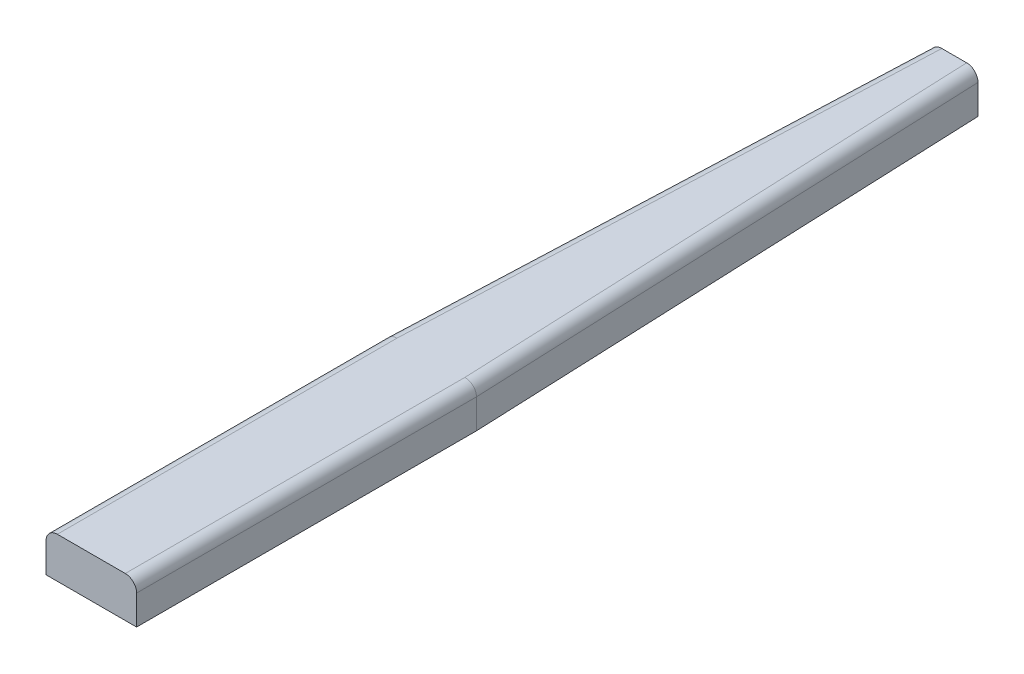
ISO-10303-21;
HEADER;
FILE_DESCRIPTION(('STEP AP214'),'2;1');
FILE_NAME('part.step','',(''),(''),'','','');
FILE_SCHEMA(('AUTOMOTIVE_DESIGN { 1 0 10303 214 1 1 1 1 }'));
ENDSEC;
DATA;
#1=APPLICATION_CONTEXT('core data for automotive mechanical design processes');
#2=APPLICATION_PROTOCOL_DEFINITION('international standard','automotive_design',2000,#1);
#3=PRODUCT_CONTEXT('',#1,'mechanical');
#4=PRODUCT('Part','Part','',(#3));
#5=PRODUCT_RELATED_PRODUCT_CATEGORY('part','',(#4));
#6=PRODUCT_DEFINITION_FORMATION('','',#4);
#7=PRODUCT_DEFINITION_CONTEXT('part definition',#1,'design');
#8=PRODUCT_DEFINITION('design','',#6,#7);
#9=PRODUCT_DEFINITION_SHAPE('','',#8);
#10=(LENGTH_UNIT() NAMED_UNIT(*) SI_UNIT(.MILLI.,.METRE.));
#11=(NAMED_UNIT(*) PLANE_ANGLE_UNIT() SI_UNIT($,.RADIAN.));
#12=(NAMED_UNIT(*) SI_UNIT($,.STERADIAN.) SOLID_ANGLE_UNIT());
#13=UNCERTAINTY_MEASURE_WITH_UNIT(LENGTH_MEASURE(1.E-05),#10,'distance_accuracy_value','');
#14=(GEOMETRIC_REPRESENTATION_CONTEXT(3) GLOBAL_UNCERTAINTY_ASSIGNED_CONTEXT((#13)) GLOBAL_UNIT_ASSIGNED_CONTEXT((#10,
#11,#12)) REPRESENTATION_CONTEXT('',''));
#15=CARTESIAN_POINT('',(0.,0.,0.));
#16=DIRECTION('',(0.,0.,1.));
#17=DIRECTION('',(1.,0.,0.));
#18=AXIS2_PLACEMENT_3D('',#15,#16,#17);
#19=CARTESIAN_POINT('',(-50.8100231326969,5.08000000000002,0.));
#20=DIRECTION('',(0.,1.,0.));
#21=DIRECTION('',(0.,0.,1.));
#22=AXIS2_PLACEMENT_3D('',#19,#20,#21);
#23=PLANE('',#22);
#24=DIRECTION('',(0.,0.,-1.));
#25=VECTOR('',#24,1.);
#26=CARTESIAN_POINT('',(-50.8,5.08000000000002,-381.1016));
#27=LINE('',#26,#25);
#28=CARTESIAN_POINT('',(-50.8,5.08000000000002,0.));
#29=VERTEX_POINT('',#28);
#30=CARTESIAN_POINT('',(-50.8,5.08000000000002,-381.1016));
#31=VERTEX_POINT('',#30);
#32=EDGE_CURVE('E136',#29,#31,#27,.T.);
#33=ORIENTED_EDGE('',*,*,#32,.T.);
#34=DIRECTION('',(-0.0411377422918956,0.,0.999153484785559));
#35=VECTOR('',#34,1.);
#36=CARTESIAN_POINT('',(-66.3784184874971,5.08000000000002,-2.732971775671));
#37=LINE('',#36,#35);
#38=CARTESIAN_POINT('',(-26.6456892184653,5.08000000000002,-967.761500261916));
#39=VERTEX_POINT('',#38);
#40=EDGE_CURVE('E49',#39,#31,#37,.T.);
#41=ORIENTED_EDGE('',*,*,#40,.F.);
#42=DIRECTION('',(-1.,0.,0.));
#43=VECTOR('',#42,1.);
#44=CARTESIAN_POINT('',(0.,5.08000000000002,-967.761500261916));
#45=LINE('',#44,#43);
#46=CARTESIAN_POINT('',(26.6456892184653,5.08000000000002,-967.761500261916));
#47=VERTEX_POINT('',#46);
#48=EDGE_CURVE('E11',#47,#39,#45,.T.);
#49=ORIENTED_EDGE('',*,*,#48,.F.);
#50=DIRECTION('',(-0.0411377422918955,0.,-0.999153484785559));
#51=VECTOR('',#50,1.);
#52=CARTESIAN_POINT('',(66.3784184874971,5.08000000000002,-2.73297177567099));
#53=LINE('',#52,#51);
#54=CARTESIAN_POINT('',(50.8,5.08000000000002,-381.1016));
#55=VERTEX_POINT('',#54);
#56=EDGE_CURVE('E54',#55,#47,#53,.T.);
#57=ORIENTED_EDGE('',*,*,#56,.F.);
#58=DIRECTION('',(0.,0.,1.));
#59=VECTOR('',#58,1.);
#60=CARTESIAN_POINT('',(50.8,5.08000000000002,-381.1016));
#61=LINE('',#60,#59);
#62=CARTESIAN_POINT('',(50.8,5.08000000000002,0.));
#63=VERTEX_POINT('',#62);
#64=EDGE_CURVE('E61',#55,#63,#61,.T.);
#65=ORIENTED_EDGE('',*,*,#64,.T.);
#66=DIRECTION('',(1.,0.,0.));
#67=VECTOR('',#66,1.);
#68=CARTESIAN_POINT('',(-50.8100231326969,5.08000000000002,0.));
#69=LINE('',#68,#67);
#70=EDGE_CURVE('E173',#29,#63,#69,.T.);
#71=ORIENTED_EDGE('',*,*,#70,.F.);
#72=EDGE_LOOP('',(#33,#41,#49,#57,#65,#71));
#73=FACE_BOUND('',#72,.T.);
#74=ADVANCED_FACE('F45',(#73),#23,.F.);
#75=CARTESIAN_POINT('',(53.6891692307205,38.1,-2.21052244856392));
#76=DIRECTION('',(-0.0411377422918955,0.,-0.999153484785559));
#77=DIRECTION('',(-0.999153484785559,0.,0.0411377422918955));
#78=AXIS2_PLACEMENT_3D('',#75,#76,#77);
#79=CYLINDRICAL_SURFACE('',#78,12.7);
#80=CARTESIAN_POINT('',(13.9349293668638,38.1,-967.761500261916));
#81=DIRECTION('',(0.,0.,1.));
#82=DIRECTION('',(-1.,0.,0.));
#83=AXIS2_PLACEMENT_3D('',#80,#81,#82);
#84=ELLIPSE('',#83,12.7107598516015,12.7);
#85=CARTESIAN_POINT('',(13.9349293668638,50.8,-967.761500261916));
#86=VERTEX_POINT('',#85);
#87=CARTESIAN_POINT('',(26.6456892184653,38.1,-967.761500261916));
#88=VERTEX_POINT('',#87);
#89=EDGE_CURVE('E198',#86,#88,#84,.F.);
#90=ORIENTED_EDGE('',*,*,#89,.F.);
#91=DIRECTION('',(0.0411377422918955,0.,0.999153484785559));
#92=VECTOR('',#91,1.);
#93=CARTESIAN_POINT('',(6.36075074322342,50.8,-1151.72315067289));
#94=LINE('',#93,#92);
#95=CARTESIAN_POINT('',(38.1,50.8,-380.840264724303));
#96=VERTEX_POINT('',#95);
#97=EDGE_CURVE('E152',#96,#86,#94,.F.);
#98=ORIENTED_EDGE('',*,*,#97,.F.);
#99=CARTESIAN_POINT('',(38.0999999999999,38.1,-380.840264724309));
#100=DIRECTION('',(-0.0205732254938469,0.,-0.999788348798274));
#101=DIRECTION('',(-0.999788348798274,0.,0.0205732254938442));
#102=AXIS2_PLACEMENT_3D('',#99,#100,#101);
#103=ELLIPSE('',#102,12.7026885392945,12.7);
#104=CARTESIAN_POINT('',(50.8,38.1,-381.1016));
#105=VERTEX_POINT('',#104);
#106=EDGE_CURVE('E169',#105,#96,#103,.F.);
#107=ORIENTED_EDGE('',*,*,#106,.F.);
#108=DIRECTION('',(0.0411377422918955,0.,0.999153484785559));
#109=VECTOR('',#108,1.);
#110=CARTESIAN_POINT('',(50.8000000000001,38.1,-381.101599999996));
#111=LINE('',#110,#109);
#112=EDGE_CURVE('E178',#88,#105,#111,.T.);
#113=ORIENTED_EDGE('',*,*,#112,.F.);
#114=EDGE_LOOP('',(#90,#98,#107,#113));
#115=FACE_BOUND('',#114,.T.);
#116=ADVANCED_FACE('F196',(#115),#79,.T.);
#117=CARTESIAN_POINT('',(-37.9388116569906,38.1,-384.755207199316));
#118=DIRECTION('',(0.0411377422918956,0.,-0.999153484785559));
#119=DIRECTION('',(-0.999153484785559,0.,-0.0411377422918956));
#120=AXIS2_PLACEMENT_3D('',#117,#118,#119);
#121=CYLINDRICAL_SURFACE('',#120,12.7);
#122=CARTESIAN_POINT('',(-13.9349293668638,38.1,-967.761500261916));
#123=DIRECTION('',(0.,0.,1.));
#124=DIRECTION('',(1.,0.,0.));
#125=AXIS2_PLACEMENT_3D('',#122,#123,#124);
#126=ELLIPSE('',#125,12.7107598516015,12.7);
#127=CARTESIAN_POINT('',(-26.6456892184653,38.1,-967.761500261916));
#128=VERTEX_POINT('',#127);
#129=CARTESIAN_POINT('',(-13.9349293668638,50.8,-967.761500261916));
#130=VERTEX_POINT('',#129);
#131=EDGE_CURVE('E207',#128,#130,#126,.F.);
#132=ORIENTED_EDGE('',*,*,#131,.F.);
#133=DIRECTION('',(-0.0411377422918956,0.,0.999153484785559));
#134=VECTOR('',#133,1.);
#135=CARTESIAN_POINT('',(-19.05,38.1,-1152.2456));
#136=LINE('',#135,#134);
#137=CARTESIAN_POINT('',(-50.8,38.1,-381.1016));
#138=VERTEX_POINT('',#137);
#139=EDGE_CURVE('E127',#138,#128,#136,.F.);
#140=ORIENTED_EDGE('',*,*,#139,.F.);
#141=CARTESIAN_POINT('',(-38.1,38.1,-380.840264724303));
#142=DIRECTION('',(0.0205732254938469,0.,-0.999788348798274));
#143=DIRECTION('',(0.999788348798274,0.,0.0205732254938469));
#144=AXIS2_PLACEMENT_3D('',#141,#142,#143);
#145=ELLIPSE('',#144,12.7026885392945,12.7);
#146=CARTESIAN_POINT('',(-38.1,50.8,-380.840264724303));
#147=VERTEX_POINT('',#146);
#148=EDGE_CURVE('E138',#147,#138,#145,.F.);
#149=ORIENTED_EDGE('',*,*,#148,.F.);
#150=DIRECTION('',(-0.0411377422918956,0.,0.999153484785559));
#151=VECTOR('',#150,1.);
#152=CARTESIAN_POINT('',(-38.1107507432235,50.8,-380.57915067289));
#153=LINE('',#152,#151);
#154=EDGE_CURVE('E161',#130,#147,#153,.T.);
#155=ORIENTED_EDGE('',*,*,#154,.F.);
#156=EDGE_LOOP('',(#132,#140,#149,#155));
#157=FACE_BOUND('',#156,.T.);
#158=ADVANCED_FACE('F236',(#157),#121,.T.);
#159=CARTESIAN_POINT('',(-38.1,38.1,-381.1016));
#160=DIRECTION('',(0.,0.,1.));
#161=DIRECTION('',(1.,0.,0.));
#162=AXIS2_PLACEMENT_3D('',#159,#160,#161);
#163=CYLINDRICAL_SURFACE('',#162,12.7);
#164=ORIENTED_EDGE('',*,*,#148,.T.);
#165=DIRECTION('',(0.,0.,1.));
#166=VECTOR('',#165,1.);
#167=CARTESIAN_POINT('',(-50.8,38.1,-381.1016));
#168=LINE('',#167,#166);
#169=CARTESIAN_POINT('',(-50.8,38.1,0.));
#170=VERTEX_POINT('',#169);
#171=EDGE_CURVE('E134',#170,#138,#168,.F.);
#172=ORIENTED_EDGE('',*,*,#171,.F.);
#173=CARTESIAN_POINT('',(-38.1,38.1,0.));
#174=DIRECTION('',(0.,0.,1.));
#175=DIRECTION('',(1.,0.,0.));
#176=AXIS2_PLACEMENT_3D('',#173,#174,#175);
#177=CIRCLE('',#176,12.7);
#178=CARTESIAN_POINT('',(-38.1,50.8,0.));
#179=VERTEX_POINT('',#178);
#180=EDGE_CURVE('E117',#179,#170,#177,.T.);
#181=ORIENTED_EDGE('',*,*,#180,.F.);
#182=DIRECTION('',(0.,0.,1.));
#183=VECTOR('',#182,1.);
#184=CARTESIAN_POINT('',(-38.1,50.8,-381.1016));
#185=LINE('',#184,#183);
#186=EDGE_CURVE('E164',#147,#179,#185,.T.);
#187=ORIENTED_EDGE('',*,*,#186,.F.);
#188=EDGE_LOOP('',(#164,#172,#181,#187));
#189=FACE_BOUND('',#188,.T.);
#190=ADVANCED_FACE('F141',(#189),#163,.T.);
#191=CARTESIAN_POINT('',(50.8,50.8,-381.1016));
#192=DIRECTION('',(0.,1.,0.));
#193=DIRECTION('',(-1.,0.,0.));
#194=AXIS2_PLACEMENT_3D('',#191,#192,#193);
#195=PLANE('',#194);
#196=DIRECTION('',(1.,0.,0.));
#197=VECTOR('',#196,1.);
#198=CARTESIAN_POINT('',(-177.8508,50.8,-967.761500261916));
#199=LINE('',#198,#197);
#200=EDGE_CURVE('E202',#130,#86,#199,.T.);
#201=ORIENTED_EDGE('',*,*,#200,.F.);
#202=ORIENTED_EDGE('',*,*,#154,.T.);
#203=ORIENTED_EDGE('',*,*,#186,.T.);
#204=DIRECTION('',(-1.,0.,0.));
#205=VECTOR('',#204,1.);
#206=CARTESIAN_POINT('',(50.8,50.8,0.));
#207=LINE('',#206,#205);
#208=CARTESIAN_POINT('',(38.1,50.8,0.));
#209=VERTEX_POINT('',#208);
#210=EDGE_CURVE('E122',#209,#179,#207,.T.);
#211=ORIENTED_EDGE('',*,*,#210,.F.);
#212=DIRECTION('',(0.,0.,1.));
#213=VECTOR('',#212,1.);
#214=CARTESIAN_POINT('',(38.1,50.8,-381.1016));
#215=LINE('',#214,#213);
#216=EDGE_CURVE('E157',#209,#96,#215,.F.);
#217=ORIENTED_EDGE('',*,*,#216,.T.);
#218=ORIENTED_EDGE('',*,*,#97,.T.);
#219=EDGE_LOOP('',(#201,#202,#203,#211,#217,#218));
#220=FACE_BOUND('',#219,.T.);
#221=ADVANCED_FACE('F201',(#220),#195,.T.);
#222=CARTESIAN_POINT('',(38.1,38.1,-381.1016));
#223=DIRECTION('',(0.,0.,1.));
#224=DIRECTION('',(1.,0.,0.));
#225=AXIS2_PLACEMENT_3D('',#222,#223,#224);
#226=CYLINDRICAL_SURFACE('',#225,12.7);
#227=ORIENTED_EDGE('',*,*,#106,.T.);
#228=ORIENTED_EDGE('',*,*,#216,.F.);
#229=CARTESIAN_POINT('',(38.1,38.1,0.));
#230=DIRECTION('',(0.,0.,1.));
#231=DIRECTION('',(1.,0.,0.));
#232=AXIS2_PLACEMENT_3D('',#229,#230,#231);
#233=CIRCLE('',#232,12.7);
#234=CARTESIAN_POINT('',(50.8,38.1,0.));
#235=VERTEX_POINT('',#234);
#236=EDGE_CURVE('E128',#235,#209,#233,.T.);
#237=ORIENTED_EDGE('',*,*,#236,.F.);
#238=DIRECTION('',(0.,0.,1.));
#239=VECTOR('',#238,1.);
#240=CARTESIAN_POINT('',(50.8,38.1,-381.1016));
#241=LINE('',#240,#239);
#242=EDGE_CURVE('E182',#105,#235,#241,.T.);
#243=ORIENTED_EDGE('',*,*,#242,.F.);
#244=EDGE_LOOP('',(#227,#228,#237,#243));
#245=FACE_BOUND('',#244,.T.);
#246=ADVANCED_FACE('F190',(#245),#226,.T.);
#247=CARTESIAN_POINT('',(50.8,-50.8,-381.1016));
#248=DIRECTION('',(1.,0.,0.));
#249=DIRECTION('',(0.,0.,-1.));
#250=AXIS2_PLACEMENT_3D('',#247,#248,#249);
#251=PLANE('',#250);
#252=ORIENTED_EDGE('',*,*,#64,.F.);
#253=DIRECTION('',(0.,1.,0.));
#254=VECTOR('',#253,1.);
#255=CARTESIAN_POINT('',(50.8,-50.8,-381.1016));
#256=LINE('',#255,#254);
#257=EDGE_CURVE('E143',#55,#105,#256,.T.);
#258=ORIENTED_EDGE('',*,*,#257,.T.);
#259=ORIENTED_EDGE('',*,*,#242,.T.);
#260=DIRECTION('',(0.,1.,0.));
#261=VECTOR('',#260,1.);
#262=CARTESIAN_POINT('',(50.8,-50.8,0.));
#263=LINE('',#262,#261);
#264=EDGE_CURVE('E137',#63,#235,#263,.T.);
#265=ORIENTED_EDGE('',*,*,#264,.F.);
#266=EDGE_LOOP('',(#252,#258,#259,#265));
#267=FACE_BOUND('',#266,.T.);
#268=ADVANCED_FACE('F222',(#267),#251,.T.);
#269=CARTESIAN_POINT('',(-50.8,-50.8,-381.1016));
#270=DIRECTION('',(-1.,0.,0.));
#271=DIRECTION('',(0.,0.,1.));
#272=AXIS2_PLACEMENT_3D('',#269,#270,#271);
#273=PLANE('',#272);
#274=DIRECTION('',(0.,1.,0.));
#275=VECTOR('',#274,1.);
#276=CARTESIAN_POINT('',(-50.8,-50.8,-381.1016));
#277=LINE('',#276,#275);
#278=EDGE_CURVE('E146',#138,#31,#277,.F.);
#279=ORIENTED_EDGE('',*,*,#278,.T.);
#280=ORIENTED_EDGE('',*,*,#32,.F.);
#281=DIRECTION('',(0.,-1.,0.));
#282=VECTOR('',#281,1.);
#283=CARTESIAN_POINT('',(-50.8,-50.8,0.));
#284=LINE('',#283,#282);
#285=EDGE_CURVE('E120',#170,#29,#284,.T.);
#286=ORIENTED_EDGE('',*,*,#285,.F.);
#287=ORIENTED_EDGE('',*,*,#171,.T.);
#288=EDGE_LOOP('',(#279,#280,#286,#287));
#289=FACE_BOUND('',#288,.T.);
#290=ADVANCED_FACE('F133',(#289),#273,.T.);
#291=CARTESIAN_POINT('',(0.,0.,0.));
#292=DIRECTION('',(0.,0.,1.));
#293=DIRECTION('',(1.,0.,0.));
#294=AXIS2_PLACEMENT_3D('',#291,#292,#293);
#295=PLANE('',#294);
#296=ORIENTED_EDGE('',*,*,#285,.T.);
#297=ORIENTED_EDGE('',*,*,#70,.T.);
#298=ORIENTED_EDGE('',*,*,#264,.T.);
#299=ORIENTED_EDGE('',*,*,#236,.T.);
#300=ORIENTED_EDGE('',*,*,#210,.T.);
#301=ORIENTED_EDGE('',*,*,#180,.T.);
#302=EDGE_LOOP('',(#296,#297,#298,#299,#300,#301));
#303=FACE_BOUND('',#302,.T.);
#304=ADVANCED_FACE('F119',(#303),#295,.T.);
#305=CARTESIAN_POINT('',(0.,0.,-967.761500261916));
#306=DIRECTION('',(0.,0.,1.));
#307=DIRECTION('',(1.,0.,0.));
#308=AXIS2_PLACEMENT_3D('',#305,#306,#307);
#309=PLANE('',#308);
#310=DIRECTION('',(0.,1.,0.));
#311=VECTOR('',#310,1.);
#312=CARTESIAN_POINT('',(26.6456892184653,0.,-967.761500261916));
#313=LINE('',#312,#311);
#314=EDGE_CURVE('E212',#47,#88,#313,.T.);
#315=ORIENTED_EDGE('',*,*,#314,.F.);
#316=ORIENTED_EDGE('',*,*,#48,.T.);
#317=DIRECTION('',(0.,-1.,0.));
#318=VECTOR('',#317,1.);
#319=CARTESIAN_POINT('',(-26.6456892184653,0.,-967.761500261916));
#320=LINE('',#319,#318);
#321=EDGE_CURVE('E177',#128,#39,#320,.T.);
#322=ORIENTED_EDGE('',*,*,#321,.F.);
#323=ORIENTED_EDGE('',*,*,#131,.T.);
#324=ORIENTED_EDGE('',*,*,#200,.T.);
#325=ORIENTED_EDGE('',*,*,#89,.T.);
#326=EDGE_LOOP('',(#315,#316,#322,#323,#324,#325));
#327=FACE_BOUND('',#326,.T.);
#328=ADVANCED_FACE('F47',(#327),#309,.F.);
#329=CARTESIAN_POINT('',(-66.3784184874971,0.,-2.732971775671));
#330=DIRECTION('',(0.999153484785559,0.,0.0411377422918956));
#331=DIRECTION('',(0.0411377422918956,0.,-0.999153484785559));
#332=AXIS2_PLACEMENT_3D('',#329,#330,#331);
#333=PLANE('',#332);
#334=ORIENTED_EDGE('',*,*,#321,.T.);
#335=ORIENTED_EDGE('',*,*,#40,.T.);
#336=ORIENTED_EDGE('',*,*,#278,.F.);
#337=ORIENTED_EDGE('',*,*,#139,.T.);
#338=EDGE_LOOP('',(#334,#335,#336,#337));
#339=FACE_BOUND('',#338,.T.);
#340=ADVANCED_FACE('F219',(#339),#333,.F.);
#341=CARTESIAN_POINT('',(66.3784184874971,0.,-2.73297177567099));
#342=DIRECTION('',(-0.999153484785559,0.,0.0411377422918955));
#343=DIRECTION('',(0.0411377422918955,0.,0.999153484785559));
#344=AXIS2_PLACEMENT_3D('',#341,#342,#343);
#345=PLANE('',#344);
#346=ORIENTED_EDGE('',*,*,#257,.F.);
#347=ORIENTED_EDGE('',*,*,#56,.T.);
#348=ORIENTED_EDGE('',*,*,#314,.T.);
#349=ORIENTED_EDGE('',*,*,#112,.T.);
#350=EDGE_LOOP('',(#346,#347,#348,#349));
#351=FACE_BOUND('',#350,.T.);
#352=ADVANCED_FACE('F223',(#351),#345,.F.);
#353=CLOSED_SHELL('',(#74,#116,#158,#190,#221,#246,#268,#290,#304,#328,#340,#352));
#354=MANIFOLD_SOLID_BREP('B2',#353);
#355=ADVANCED_BREP_SHAPE_REPRESENTATION('',(#18,#354),#14);
#356=SHAPE_DEFINITION_REPRESENTATION(#9,#355);
ENDSEC;
END-ISO-10303-21;
